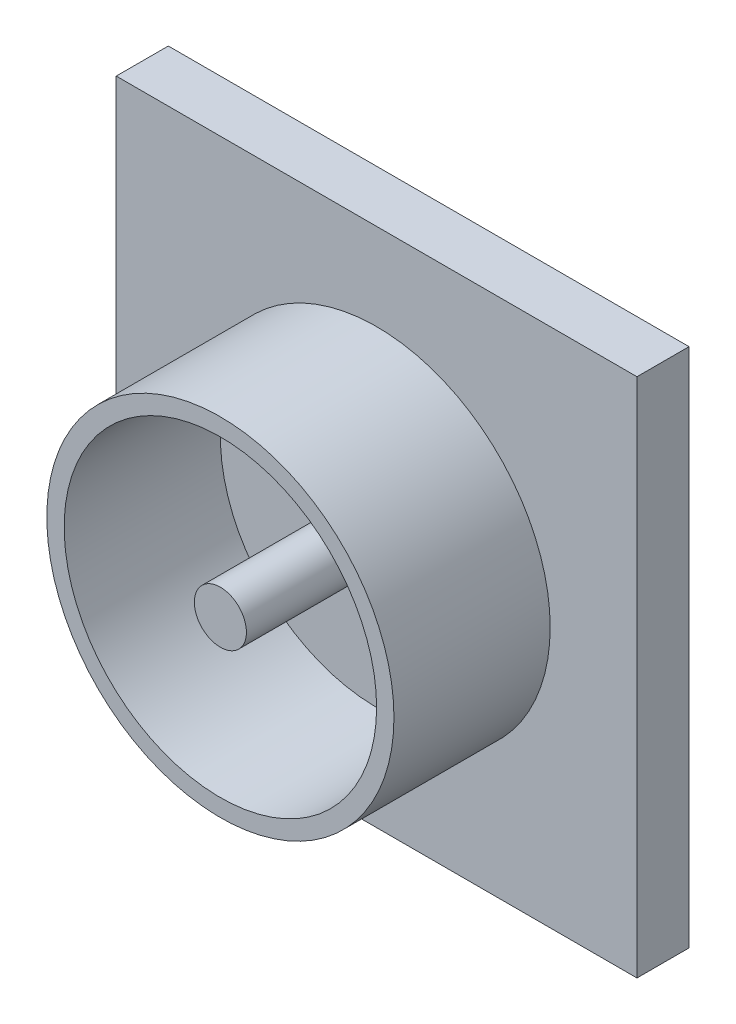
ISO-10303-21;
HEADER;
FILE_DESCRIPTION(('STEP AP214'),'2;1');
FILE_NAME('part.step','',(''),(''),'','','');
FILE_SCHEMA(('AUTOMOTIVE_DESIGN { 1 0 10303 214 1 1 1 1 }'));
ENDSEC;
DATA;
#1=APPLICATION_CONTEXT('core data for automotive mechanical design processes');
#2=APPLICATION_PROTOCOL_DEFINITION('international standard','automotive_design',2000,#1);
#3=PRODUCT_CONTEXT('',#1,'mechanical');
#4=PRODUCT('Part','Part','',(#3));
#5=PRODUCT_RELATED_PRODUCT_CATEGORY('part','',(#4));
#6=PRODUCT_DEFINITION_FORMATION('','',#4);
#7=PRODUCT_DEFINITION_CONTEXT('part definition',#1,'design');
#8=PRODUCT_DEFINITION('design','',#6,#7);
#9=PRODUCT_DEFINITION_SHAPE('','',#8);
#10=(LENGTH_UNIT() NAMED_UNIT(*) SI_UNIT(.MILLI.,.METRE.));
#11=(NAMED_UNIT(*) PLANE_ANGLE_UNIT() SI_UNIT($,.RADIAN.));
#12=(NAMED_UNIT(*) SI_UNIT($,.STERADIAN.) SOLID_ANGLE_UNIT());
#13=UNCERTAINTY_MEASURE_WITH_UNIT(LENGTH_MEASURE(1.E-05),#10,'distance_accuracy_value','');
#14=(GEOMETRIC_REPRESENTATION_CONTEXT(3) GLOBAL_UNCERTAINTY_ASSIGNED_CONTEXT((#13)) GLOBAL_UNIT_ASSIGNED_CONTEXT((#10,
#11,#12)) REPRESENTATION_CONTEXT('',''));
#15=CARTESIAN_POINT('',(0.,0.,0.));
#16=DIRECTION('',(0.,0.,1.));
#17=DIRECTION('',(1.,0.,0.));
#18=AXIS2_PLACEMENT_3D('',#15,#16,#17);
#19=CARTESIAN_POINT('',(-1.5,-1.5,0.3));
#20=DIRECTION('',(1.,0.,0.));
#21=DIRECTION('',(0.,0.,-1.));
#22=AXIS2_PLACEMENT_3D('',#19,#20,#21);
#23=PLANE('',#22);
#24=DIRECTION('',(0.,-1.,0.));
#25=VECTOR('',#24,1.);
#26=CARTESIAN_POINT('',(-1.5,-1.5,0.));
#27=LINE('',#26,#25);
#28=CARTESIAN_POINT('',(-1.5,1.5,0.));
#29=VERTEX_POINT('',#28);
#30=CARTESIAN_POINT('',(-1.5,-1.5,0.));
#31=VERTEX_POINT('',#30);
#32=EDGE_CURVE('E118',#29,#31,#27,.T.);
#33=ORIENTED_EDGE('',*,*,#32,.T.);
#34=DIRECTION('',(0.,0.,-1.));
#35=VECTOR('',#34,1.);
#36=CARTESIAN_POINT('',(-1.5,-1.5,0.3));
#37=LINE('',#36,#35);
#38=CARTESIAN_POINT('',(-1.5,-1.5,0.3));
#39=VERTEX_POINT('',#38);
#40=EDGE_CURVE('E56',#39,#31,#37,.T.);
#41=ORIENTED_EDGE('',*,*,#40,.F.);
#42=DIRECTION('',(0.,-1.,0.));
#43=VECTOR('',#42,1.);
#44=CARTESIAN_POINT('',(-1.5,-1.5,0.3));
#45=LINE('',#44,#43);
#46=CARTESIAN_POINT('',(-1.5,1.5,0.3));
#47=VERTEX_POINT('',#46);
#48=EDGE_CURVE('E100',#47,#39,#45,.T.);
#49=ORIENTED_EDGE('',*,*,#48,.F.);
#50=DIRECTION('',(0.,0.,-1.));
#51=VECTOR('',#50,1.);
#52=CARTESIAN_POINT('',(-1.5,1.5,0.3));
#53=LINE('',#52,#51);
#54=EDGE_CURVE('E114',#47,#29,#53,.T.);
#55=ORIENTED_EDGE('',*,*,#54,.T.);
#56=EDGE_LOOP('',(#33,#41,#49,#55));
#57=FACE_BOUND('',#56,.T.);
#58=ADVANCED_FACE('F47',(#57),#23,.F.);
#59=CARTESIAN_POINT('',(1.5,-1.5,0.3));
#60=DIRECTION('',(0.,1.,0.));
#61=DIRECTION('',(-1.,0.,0.));
#62=AXIS2_PLACEMENT_3D('',#59,#60,#61);
#63=PLANE('',#62);
#64=DIRECTION('',(1.,0.,0.));
#65=VECTOR('',#64,1.);
#66=CARTESIAN_POINT('',(1.5,-1.5,0.));
#67=LINE('',#66,#65);
#68=CARTESIAN_POINT('',(1.5,-1.5,0.));
#69=VERTEX_POINT('',#68);
#70=EDGE_CURVE('E106',#31,#69,#67,.T.);
#71=ORIENTED_EDGE('',*,*,#70,.T.);
#72=DIRECTION('',(0.,0.,-1.));
#73=VECTOR('',#72,1.);
#74=CARTESIAN_POINT('',(1.5,-1.5,0.3));
#75=LINE('',#74,#73);
#76=CARTESIAN_POINT('',(1.5,-1.5,0.3));
#77=VERTEX_POINT('',#76);
#78=EDGE_CURVE('E104',#77,#69,#75,.T.);
#79=ORIENTED_EDGE('',*,*,#78,.F.);
#80=DIRECTION('',(1.,0.,0.));
#81=VECTOR('',#80,1.);
#82=CARTESIAN_POINT('',(1.5,-1.5,0.3));
#83=LINE('',#82,#81);
#84=EDGE_CURVE('E95',#39,#77,#83,.T.);
#85=ORIENTED_EDGE('',*,*,#84,.F.);
#86=ORIENTED_EDGE('',*,*,#40,.T.);
#87=EDGE_LOOP('',(#71,#79,#85,#86));
#88=FACE_BOUND('',#87,.T.);
#89=ADVANCED_FACE('F105',(#88),#63,.F.);
#90=CARTESIAN_POINT('',(1.5,-1.5,0.3));
#91=DIRECTION('',(-1.,0.,0.));
#92=DIRECTION('',(0.,0.,1.));
#93=AXIS2_PLACEMENT_3D('',#90,#91,#92);
#94=PLANE('',#93);
#95=DIRECTION('',(0.,1.,0.));
#96=VECTOR('',#95,1.);
#97=CARTESIAN_POINT('',(1.5,-1.5,0.));
#98=LINE('',#97,#96);
#99=CARTESIAN_POINT('',(1.5,1.5,0.));
#100=VERTEX_POINT('',#99);
#101=EDGE_CURVE('E81',#69,#100,#98,.T.);
#102=ORIENTED_EDGE('',*,*,#101,.T.);
#103=DIRECTION('',(0.,0.,-1.));
#104=VECTOR('',#103,1.);
#105=CARTESIAN_POINT('',(1.5,1.5,0.3));
#106=LINE('',#105,#104);
#107=CARTESIAN_POINT('',(1.5,1.5,0.3));
#108=VERTEX_POINT('',#107);
#109=EDGE_CURVE('E108',#108,#100,#106,.T.);
#110=ORIENTED_EDGE('',*,*,#109,.F.);
#111=DIRECTION('',(0.,1.,0.));
#112=VECTOR('',#111,1.);
#113=CARTESIAN_POINT('',(1.5,-1.5,0.3));
#114=LINE('',#113,#112);
#115=EDGE_CURVE('E98',#77,#108,#114,.T.);
#116=ORIENTED_EDGE('',*,*,#115,.F.);
#117=ORIENTED_EDGE('',*,*,#78,.T.);
#118=EDGE_LOOP('',(#102,#110,#116,#117));
#119=FACE_BOUND('',#118,.T.);
#120=ADVANCED_FACE('F110',(#119),#94,.F.);
#121=CARTESIAN_POINT('',(1.5,1.5,0.3));
#122=DIRECTION('',(0.,-1.,0.));
#123=DIRECTION('',(1.,0.,0.));
#124=AXIS2_PLACEMENT_3D('',#121,#122,#123);
#125=PLANE('',#124);
#126=DIRECTION('',(-1.,0.,0.));
#127=VECTOR('',#126,1.);
#128=CARTESIAN_POINT('',(1.5,1.5,0.));
#129=LINE('',#128,#127);
#130=EDGE_CURVE('E87',#100,#29,#129,.T.);
#131=ORIENTED_EDGE('',*,*,#130,.T.);
#132=ORIENTED_EDGE('',*,*,#54,.F.);
#133=DIRECTION('',(-1.,0.,0.));
#134=VECTOR('',#133,1.);
#135=CARTESIAN_POINT('',(1.5,1.5,0.3));
#136=LINE('',#135,#134);
#137=EDGE_CURVE('E64',#108,#47,#136,.T.);
#138=ORIENTED_EDGE('',*,*,#137,.F.);
#139=ORIENTED_EDGE('',*,*,#109,.T.);
#140=EDGE_LOOP('',(#131,#132,#138,#139));
#141=FACE_BOUND('',#140,.T.);
#142=ADVANCED_FACE('F147',(#141),#125,.F.);
#143=CARTESIAN_POINT('',(0.,0.,0.3));
#144=DIRECTION('',(0.,0.,1.));
#145=DIRECTION('',(1.,0.,0.));
#146=AXIS2_PLACEMENT_3D('',#143,#144,#145);
#147=PLANE('',#146);
#148=CARTESIAN_POINT('',(0.,0.,0.3));
#149=DIRECTION('',(0.,0.,1.));
#150=DIRECTION('',(1.,0.,0.));
#151=AXIS2_PLACEMENT_3D('',#148,#149,#150);
#152=CIRCLE('',#151,1.);
#153=CARTESIAN_POINT('',(1.,0.,0.3));
#154=VERTEX_POINT('',#153);
#155=EDGE_CURVE('E232',#154,#154,#152,.T.);
#156=ORIENTED_EDGE('',*,*,#155,.F.);
#157=EDGE_LOOP('',(#156));
#158=FACE_BOUND('',#157,.T.);
#159=ORIENTED_EDGE('',*,*,#48,.T.);
#160=ORIENTED_EDGE('',*,*,#84,.T.);
#161=ORIENTED_EDGE('',*,*,#115,.T.);
#162=ORIENTED_EDGE('',*,*,#137,.T.);
#163=EDGE_LOOP('',(#159,#160,#161,#162));
#164=FACE_BOUND('',#163,.T.);
#165=ADVANCED_FACE('F96',(#158,#164),#147,.T.);
#166=CARTESIAN_POINT('',(0.,0.,0.));
#167=DIRECTION('',(0.,0.,1.));
#168=DIRECTION('',(1.,0.,0.));
#169=AXIS2_PLACEMENT_3D('',#166,#167,#168);
#170=PLANE('',#169);
#171=ORIENTED_EDGE('',*,*,#32,.F.);
#172=ORIENTED_EDGE('',*,*,#130,.F.);
#173=ORIENTED_EDGE('',*,*,#101,.F.);
#174=ORIENTED_EDGE('',*,*,#70,.F.);
#175=EDGE_LOOP('',(#171,#172,#173,#174));
#176=FACE_BOUND('',#175,.T.);
#177=ADVANCED_FACE('F136',(#176),#170,.F.);
#178=CARTESIAN_POINT('',(0.,0.,1.2));
#179=DIRECTION('',(0.,0.,-1.));
#180=DIRECTION('',(-1.,0.,0.));
#181=AXIS2_PLACEMENT_3D('',#178,#179,#180);
#182=CYLINDRICAL_SURFACE('',#181,0.9);
#183=CARTESIAN_POINT('',(0.,0.,1.2));
#184=DIRECTION('',(0.,0.,1.));
#185=DIRECTION('',(1.,0.,0.));
#186=AXIS2_PLACEMENT_3D('',#183,#184,#185);
#187=CIRCLE('',#186,0.9);
#188=CARTESIAN_POINT('',(0.9,0.,1.2));
#189=VERTEX_POINT('',#188);
#190=EDGE_CURVE('E238',#189,#189,#187,.T.);
#191=ORIENTED_EDGE('',*,*,#190,.T.);
#192=EDGE_LOOP('',(#191));
#193=FACE_BOUND('',#192,.T.);
#194=CARTESIAN_POINT('',(0.,0.,0.3));
#195=DIRECTION('',(0.,0.,1.));
#196=DIRECTION('',(1.,0.,0.));
#197=AXIS2_PLACEMENT_3D('',#194,#195,#196);
#198=CIRCLE('',#197,0.9);
#199=CARTESIAN_POINT('',(0.9,0.,0.3));
#200=VERTEX_POINT('',#199);
#201=EDGE_CURVE('E12',#200,#200,#198,.F.);
#202=ORIENTED_EDGE('',*,*,#201,.T.);
#203=EDGE_LOOP('',(#202));
#204=FACE_BOUND('',#203,.T.);
#205=ADVANCED_FACE('F138',(#193,#204),#182,.F.);
#206=CARTESIAN_POINT('',(0.,0.,1.2));
#207=DIRECTION('',(0.,0.,-1.));
#208=DIRECTION('',(-1.,0.,0.));
#209=AXIS2_PLACEMENT_3D('',#206,#207,#208);
#210=CYLINDRICAL_SURFACE('',#209,1.);
#211=CARTESIAN_POINT('',(0.,0.,1.2));
#212=DIRECTION('',(0.,0.,1.));
#213=DIRECTION('',(1.,0.,0.));
#214=AXIS2_PLACEMENT_3D('',#211,#212,#213);
#215=CIRCLE('',#214,1.);
#216=CARTESIAN_POINT('',(1.,0.,1.2));
#217=VERTEX_POINT('',#216);
#218=EDGE_CURVE('E122',#217,#217,#215,.T.);
#219=ORIENTED_EDGE('',*,*,#218,.F.);
#220=EDGE_LOOP('',(#219));
#221=FACE_BOUND('',#220,.T.);
#222=ORIENTED_EDGE('',*,*,#155,.T.);
#223=EDGE_LOOP('',(#222));
#224=FACE_BOUND('',#223,.T.);
#225=ADVANCED_FACE('F144',(#221,#224),#210,.T.);
#226=CARTESIAN_POINT('',(0.,0.,1.2));
#227=DIRECTION('',(0.,0.,1.));
#228=DIRECTION('',(1.,0.,0.));
#229=AXIS2_PLACEMENT_3D('',#226,#227,#228);
#230=PLANE('',#229);
#231=ORIENTED_EDGE('',*,*,#190,.F.);
#232=EDGE_LOOP('',(#231));
#233=FACE_BOUND('',#232,.T.);
#234=ORIENTED_EDGE('',*,*,#218,.T.);
#235=EDGE_LOOP('',(#234));
#236=FACE_BOUND('',#235,.T.);
#237=ADVANCED_FACE('F187',(#233,#236),#230,.T.);
#238=CARTESIAN_POINT('',(0.,0.,0.3));
#239=DIRECTION('',(0.,0.,1.));
#240=DIRECTION('',(1.,0.,0.));
#241=AXIS2_PLACEMENT_3D('',#238,#239,#240);
#242=CIRCLE('',#241,0.15);
#243=CARTESIAN_POINT('',(0.15,0.,0.3));
#244=VERTEX_POINT('',#243);
#245=EDGE_CURVE('E233',#244,#244,#242,.T.);
#246=ORIENTED_EDGE('',*,*,#245,.F.);
#247=EDGE_LOOP('',(#246));
#248=FACE_BOUND('',#247,.T.);
#249=ORIENTED_EDGE('',*,*,#201,.F.);
#250=EDGE_LOOP('',(#249));
#251=FACE_BOUND('',#250,.T.);
#252=ADVANCED_FACE('F150',(#248,#251),#147,.T.);
#253=CARTESIAN_POINT('',(0.,0.,1.2));
#254=DIRECTION('',(0.,0.,-1.));
#255=DIRECTION('',(-1.,0.,0.));
#256=AXIS2_PLACEMENT_3D('',#253,#254,#255);
#257=CYLINDRICAL_SURFACE('',#256,0.15);
#258=CARTESIAN_POINT('',(0.,0.,1.2));
#259=DIRECTION('',(0.,0.,1.));
#260=DIRECTION('',(1.,0.,0.));
#261=AXIS2_PLACEMENT_3D('',#258,#259,#260);
#262=CIRCLE('',#261,0.15);
#263=CARTESIAN_POINT('',(0.15,0.,1.2));
#264=VERTEX_POINT('',#263);
#265=EDGE_CURVE('E230',#264,#264,#262,.T.);
#266=ORIENTED_EDGE('',*,*,#265,.F.);
#267=EDGE_LOOP('',(#266));
#268=FACE_BOUND('',#267,.T.);
#269=ORIENTED_EDGE('',*,*,#245,.T.);
#270=EDGE_LOOP('',(#269));
#271=FACE_BOUND('',#270,.T.);
#272=ADVANCED_FACE('F206',(#268,#271),#257,.T.);
#273=CARTESIAN_POINT('',(0.,0.,1.2));
#274=DIRECTION('',(0.,0.,1.));
#275=DIRECTION('',(1.,0.,0.));
#276=AXIS2_PLACEMENT_3D('',#273,#274,#275);
#277=PLANE('',#276);
#278=ORIENTED_EDGE('',*,*,#265,.T.);
#279=EDGE_LOOP('',(#278));
#280=FACE_BOUND('',#279,.T.);
#281=ADVANCED_FACE('F214',(#280),#277,.T.);
#282=CLOSED_SHELL('',(#58,#89,#120,#142,#165,#177,#205,#225,#237,#252,#272,#281));
#283=MANIFOLD_SOLID_BREP('B2',#282);
#284=ADVANCED_BREP_SHAPE_REPRESENTATION('',(#18,#283),#14);
#285=SHAPE_DEFINITION_REPRESENTATION(#9,#284);
ENDSEC;
END-ISO-10303-21;
